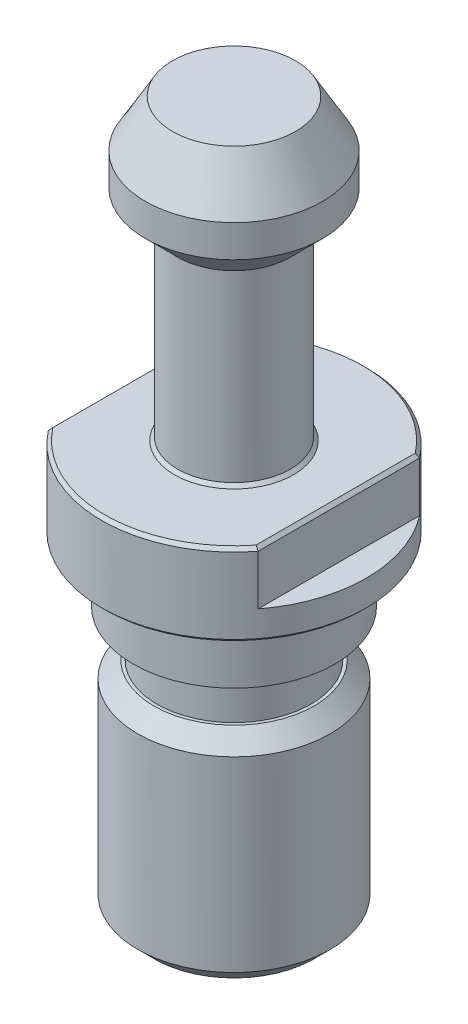
ISO-10303-21;
HEADER;
FILE_DESCRIPTION(('STEP AP214'),'2;1');
FILE_NAME('part.step','',(''),(''),'','','');
FILE_SCHEMA(('AUTOMOTIVE_DESIGN { 1 0 10303 214 1 1 1 1 }'));
ENDSEC;
DATA;
#1=APPLICATION_CONTEXT('core data for automotive mechanical design processes');
#2=APPLICATION_PROTOCOL_DEFINITION('international standard','automotive_design',2000,#1);
#3=PRODUCT_CONTEXT('',#1,'mechanical');
#4=PRODUCT('Part','Part','',(#3));
#5=PRODUCT_RELATED_PRODUCT_CATEGORY('part','',(#4));
#6=PRODUCT_DEFINITION_FORMATION('','',#4);
#7=PRODUCT_DEFINITION_CONTEXT('part definition',#1,'design');
#8=PRODUCT_DEFINITION('design','',#6,#7);
#9=PRODUCT_DEFINITION_SHAPE('','',#8);
#10=(LENGTH_UNIT() NAMED_UNIT(*) SI_UNIT(.MILLI.,.METRE.));
#11=(NAMED_UNIT(*) PLANE_ANGLE_UNIT() SI_UNIT($,.RADIAN.));
#12=(NAMED_UNIT(*) SI_UNIT($,.STERADIAN.) SOLID_ANGLE_UNIT());
#13=UNCERTAINTY_MEASURE_WITH_UNIT(LENGTH_MEASURE(1.E-05),#10,'distance_accuracy_value','');
#14=(GEOMETRIC_REPRESENTATION_CONTEXT(3) GLOBAL_UNCERTAINTY_ASSIGNED_CONTEXT((#13)) GLOBAL_UNIT_ASSIGNED_CONTEXT((#10,
#11,#12)) REPRESENTATION_CONTEXT('',''));
#15=CARTESIAN_POINT('',(0.,0.,0.));
#16=DIRECTION('',(0.,0.,1.));
#17=DIRECTION('',(1.,0.,0.));
#18=AXIS2_PLACEMENT_3D('',#15,#16,#17);
#19=CARTESIAN_POINT('',(0.,0.,0.));
#20=DIRECTION('',(0.,-1.,0.));
#21=DIRECTION('',(0.,0.,-1.));
#22=AXIS2_PLACEMENT_3D('',#19,#20,#21);
#23=CYLINDRICAL_SURFACE('',#22,8.22);
#24=CARTESIAN_POINT('',(0.,20.5,0.));
#25=DIRECTION('',(0.,-1.,0.));
#26=DIRECTION('',(0.,0.,-1.));
#27=AXIS2_PLACEMENT_3D('',#24,#25,#26);
#28=CIRCLE('',#27,8.22);
#29=CARTESIAN_POINT('',(0.,20.5,-8.22));
#30=VERTEX_POINT('',#29);
#31=EDGE_CURVE('E139',#30,#30,#28,.F.);
#32=ORIENTED_EDGE('',*,*,#31,.T.);
#33=EDGE_LOOP('',(#32));
#34=FACE_BOUND('',#33,.T.);
#35=DIRECTION('',(0.,1.,0.));
#36=VECTOR('',#35,1.);
#37=CARTESIAN_POINT('',(-6.515,22.1,-5.0123023651811));
#38=LINE('',#37,#36);
#39=CARTESIAN_POINT('',(-6.515,22.1,-5.0123023651811));
#40=VERTEX_POINT('',#39);
#41=CARTESIAN_POINT('',(-6.515,25.2,-5.0123023651811));
#42=VERTEX_POINT('',#41);
#43=EDGE_CURVE('E101',#40,#42,#38,.T.);
#44=ORIENTED_EDGE('',*,*,#43,.T.);
#45=CARTESIAN_POINT('',(0.,25.2,0.));
#46=DIRECTION('',(0.,1.,0.));
#47=DIRECTION('',(0.,0.,1.));
#48=AXIS2_PLACEMENT_3D('',#45,#46,#47);
#49=CIRCLE('',#48,8.22);
#50=CARTESIAN_POINT('',(6.515,25.2,-5.0123023651811));
#51=VERTEX_POINT('',#50);
#52=EDGE_CURVE('E137',#42,#51,#49,.F.);
#53=ORIENTED_EDGE('',*,*,#52,.T.);
#54=DIRECTION('',(0.,1.,0.));
#55=VECTOR('',#54,1.);
#56=CARTESIAN_POINT('',(6.515,22.1,-5.0123023651811));
#57=LINE('',#56,#55);
#58=CARTESIAN_POINT('',(6.515,22.1,-5.0123023651811));
#59=VERTEX_POINT('',#58);
#60=EDGE_CURVE('E199',#59,#51,#57,.T.);
#61=ORIENTED_EDGE('',*,*,#60,.F.);
#62=CARTESIAN_POINT('',(0.,22.1,0.));
#63=DIRECTION('',(0.,1.,0.));
#64=DIRECTION('',(0.,0.,1.));
#65=AXIS2_PLACEMENT_3D('',#62,#63,#64);
#66=CIRCLE('',#65,8.22);
#67=CARTESIAN_POINT('',(6.515,22.1,5.0123023651811));
#68=VERTEX_POINT('',#67);
#69=EDGE_CURVE('E118',#59,#68,#66,.F.);
#70=ORIENTED_EDGE('',*,*,#69,.T.);
#71=DIRECTION('',(0.,1.,0.));
#72=VECTOR('',#71,1.);
#73=CARTESIAN_POINT('',(6.515,22.1,5.0123023651811));
#74=LINE('',#73,#72);
#75=CARTESIAN_POINT('',(6.515,25.2,5.0123023651811));
#76=VERTEX_POINT('',#75);
#77=EDGE_CURVE('E208',#68,#76,#74,.T.);
#78=ORIENTED_EDGE('',*,*,#77,.T.);
#79=CARTESIAN_POINT('',(0.,25.2,0.));
#80=DIRECTION('',(0.,1.,0.));
#81=DIRECTION('',(0.,0.,1.));
#82=AXIS2_PLACEMENT_3D('',#79,#80,#81);
#83=CIRCLE('',#82,8.22);
#84=CARTESIAN_POINT('',(-6.515,25.2,5.0123023651811));
#85=VERTEX_POINT('',#84);
#86=EDGE_CURVE('E133',#76,#85,#83,.F.);
#87=ORIENTED_EDGE('',*,*,#86,.T.);
#88=DIRECTION('',(0.,1.,0.));
#89=VECTOR('',#88,1.);
#90=CARTESIAN_POINT('',(-6.515,22.1,5.0123023651811));
#91=LINE('',#90,#89);
#92=CARTESIAN_POINT('',(-6.515,22.1,5.0123023651811));
#93=VERTEX_POINT('',#92);
#94=EDGE_CURVE('E112',#93,#85,#91,.T.);
#95=ORIENTED_EDGE('',*,*,#94,.F.);
#96=EDGE_CURVE('E116',#93,#40,#66,.F.);
#97=ORIENTED_EDGE('',*,*,#96,.T.);
#98=EDGE_LOOP('',(#44,#53,#61,#70,#78,#87,#95,#97));
#99=FACE_BOUND('',#98,.T.);
#100=ADVANCED_FACE('F37',(#34,#99),#23,.T.);
#101=CARTESIAN_POINT('',(8.22,25.4,0.));
#102=DIRECTION('',(0.,1.,0.));
#103=DIRECTION('',(0.,0.,1.));
#104=AXIS2_PLACEMENT_3D('',#101,#102,#103);
#105=PLANE('',#104);
#106=CARTESIAN_POINT('',(0.,25.4,0.));
#107=DIRECTION('',(0.,1.,0.));
#108=DIRECTION('',(0.,0.,1.));
#109=AXIS2_PLACEMENT_3D('',#106,#107,#108);
#110=CIRCLE('',#109,8.02);
#111=CARTESIAN_POINT('',(6.315,25.4,-4.94380167482475));
#112=VERTEX_POINT('',#111);
#113=CARTESIAN_POINT('',(-6.315,25.4,-4.94380167482475));
#114=VERTEX_POINT('',#113);
#115=EDGE_CURVE('E65',#112,#114,#110,.T.);
#116=ORIENTED_EDGE('',*,*,#115,.T.);
#117=DIRECTION('',(0.,0.,1.));
#118=VECTOR('',#117,1.);
#119=CARTESIAN_POINT('',(-6.315,25.4,0.));
#120=LINE('',#119,#118);
#121=CARTESIAN_POINT('',(-6.315,25.4,4.94380167482475));
#122=VERTEX_POINT('',#121);
#123=EDGE_CURVE('E146',#114,#122,#120,.T.);
#124=ORIENTED_EDGE('',*,*,#123,.T.);
#125=CARTESIAN_POINT('',(0.,25.4,0.));
#126=DIRECTION('',(0.,1.,0.));
#127=DIRECTION('',(0.,0.,1.));
#128=AXIS2_PLACEMENT_3D('',#125,#126,#127);
#129=CIRCLE('',#128,8.02);
#130=CARTESIAN_POINT('',(6.315,25.4,4.94380167482475));
#131=VERTEX_POINT('',#130);
#132=EDGE_CURVE('E145',#122,#131,#129,.T.);
#133=ORIENTED_EDGE('',*,*,#132,.T.);
#134=DIRECTION('',(0.,0.,-1.));
#135=VECTOR('',#134,1.);
#136=CARTESIAN_POINT('',(6.315,25.4,0.));
#137=LINE('',#136,#135);
#138=EDGE_CURVE('E70',#131,#112,#137,.T.);
#139=ORIENTED_EDGE('',*,*,#138,.T.);
#140=EDGE_LOOP('',(#116,#124,#133,#139));
#141=FACE_BOUND('',#140,.T.);
#142=CARTESIAN_POINT('',(0.,25.4,0.));
#143=DIRECTION('',(0.,1.,0.));
#144=DIRECTION('',(0.,0.,1.));
#145=AXIS2_PLACEMENT_3D('',#142,#143,#144);
#146=CIRCLE('',#145,3.69999999999999);
#147=CARTESIAN_POINT('',(0.,25.4,3.69999999999999));
#148=VERTEX_POINT('',#147);
#149=EDGE_CURVE('E143',#148,#148,#146,.F.);
#150=ORIENTED_EDGE('',*,*,#149,.T.);
#151=EDGE_LOOP('',(#150));
#152=FACE_BOUND('',#151,.T.);
#153=ADVANCED_FACE('F262',(#141,#152),#105,.T.);
#154=CARTESIAN_POINT('',(0.,0.,0.));
#155=DIRECTION('',(0.,-1.,0.));
#156=DIRECTION('',(0.,0.,-1.));
#157=AXIS2_PLACEMENT_3D('',#154,#155,#156);
#158=PLANE('',#157);
#159=CARTESIAN_POINT('',(0.,0.,0.));
#160=DIRECTION('',(0.,-1.,0.));
#161=DIRECTION('',(0.,0.,-1.));
#162=AXIS2_PLACEMENT_3D('',#159,#160,#161);
#163=CIRCLE('',#162,4.97500000000001);
#164=CARTESIAN_POINT('',(0.,0.,-4.97500000000001));
#165=VERTEX_POINT('',#164);
#166=EDGE_CURVE('E124',#165,#165,#163,.T.);
#167=ORIENTED_EDGE('',*,*,#166,.T.);
#168=EDGE_LOOP('',(#167));
#169=FACE_BOUND('',#168,.T.);
#170=ADVANCED_FACE('F244',(#169),#158,.T.);
#171=CARTESIAN_POINT('',(0.,0.,0.));
#172=DIRECTION('',(0.,-1.,0.));
#173=DIRECTION('',(0.,0.,-1.));
#174=AXIS2_PLACEMENT_3D('',#171,#172,#173);
#175=CYLINDRICAL_SURFACE('',#174,5.975);
#176=CARTESIAN_POINT('',(0.,12.6,0.));
#177=DIRECTION('',(0.,1.,0.));
#178=DIRECTION('',(0.,0.,1.));
#179=AXIS2_PLACEMENT_3D('',#176,#177,#178);
#180=CIRCLE('',#179,5.975);
#181=CARTESIAN_POINT('',(0.,12.6,5.975));
#182=VERTEX_POINT('',#181);
#183=EDGE_CURVE('E237',#182,#182,#180,.F.);
#184=ORIENTED_EDGE('',*,*,#183,.T.);
#185=EDGE_LOOP('',(#184));
#186=FACE_BOUND('',#185,.T.);
#187=CARTESIAN_POINT('',(0.,1.,0.));
#188=DIRECTION('',(0.,-1.,0.));
#189=DIRECTION('',(0.,0.,-1.));
#190=AXIS2_PLACEMENT_3D('',#187,#188,#189);
#191=CIRCLE('',#190,5.975);
#192=CARTESIAN_POINT('',(0.,1.,-5.975));
#193=VERTEX_POINT('',#192);
#194=EDGE_CURVE('E232',#193,#193,#191,.F.);
#195=ORIENTED_EDGE('',*,*,#194,.T.);
#196=EDGE_LOOP('',(#195));
#197=FACE_BOUND('',#196,.T.);
#198=ADVANCED_FACE('F294',(#186,#197),#175,.T.);
#199=CARTESIAN_POINT('',(5.975,13.6,0.));
#200=DIRECTION('',(0.,1.,0.));
#201=DIRECTION('',(0.,0.,1.));
#202=AXIS2_PLACEMENT_3D('',#199,#200,#201);
#203=PLANE('',#202);
#204=CARTESIAN_POINT('',(0.,13.6,0.));
#205=DIRECTION('',(0.,1.,0.));
#206=DIRECTION('',(0.,0.,1.));
#207=AXIS2_PLACEMENT_3D('',#204,#205,#206);
#208=CIRCLE('',#207,4.975);
#209=CARTESIAN_POINT('',(0.,13.6,4.975));
#210=VERTEX_POINT('',#209);
#211=EDGE_CURVE('E236',#210,#210,#208,.T.);
#212=ORIENTED_EDGE('',*,*,#211,.T.);
#213=EDGE_LOOP('',(#212));
#214=FACE_BOUND('',#213,.T.);
#215=CARTESIAN_POINT('',(0.,13.6,0.));
#216=DIRECTION('',(0.,-1.,0.));
#217=DIRECTION('',(0.,0.,-1.));
#218=AXIS2_PLACEMENT_3D('',#215,#216,#217);
#219=CIRCLE('',#218,4.785);
#220=CARTESIAN_POINT('',(0.,13.6,-4.785));
#221=VERTEX_POINT('',#220);
#222=EDGE_CURVE('E229',#221,#221,#219,.T.);
#223=ORIENTED_EDGE('',*,*,#222,.T.);
#224=EDGE_LOOP('',(#223));
#225=FACE_BOUND('',#224,.T.);
#226=ADVANCED_FACE('F289',(#214,#225),#203,.T.);
#227=CARTESIAN_POINT('',(0.,0.,0.));
#228=DIRECTION('',(0.,-1.,0.));
#229=DIRECTION('',(0.,0.,-1.));
#230=AXIS2_PLACEMENT_3D('',#227,#228,#229);
#231=CYLINDRICAL_SURFACE('',#230,4.785);
#232=CARTESIAN_POINT('',(0.,16.5,0.));
#233=DIRECTION('',(0.,-1.,0.));
#234=DIRECTION('',(0.,0.,-1.));
#235=AXIS2_PLACEMENT_3D('',#232,#233,#234);
#236=CIRCLE('',#235,4.785);
#237=CARTESIAN_POINT('',(0.,16.5,-4.785));
#238=VERTEX_POINT('',#237);
#239=EDGE_CURVE('E230',#238,#238,#236,.T.);
#240=ORIENTED_EDGE('',*,*,#239,.T.);
#241=EDGE_LOOP('',(#240));
#242=FACE_BOUND('',#241,.T.);
#243=ORIENTED_EDGE('',*,*,#222,.F.);
#244=EDGE_LOOP('',(#243));
#245=FACE_BOUND('',#244,.T.);
#246=ADVANCED_FACE('F286',(#242,#245),#231,.T.);
#247=CARTESIAN_POINT('',(4.785,16.5,0.));
#248=DIRECTION('',(0.,-1.,0.));
#249=DIRECTION('',(0.,0.,-1.));
#250=AXIS2_PLACEMENT_3D('',#247,#248,#249);
#251=PLANE('',#250);
#252=CARTESIAN_POINT('',(0.,16.5,0.));
#253=DIRECTION('',(0.,-1.,0.));
#254=DIRECTION('',(0.,0.,-1.));
#255=AXIS2_PLACEMENT_3D('',#252,#253,#254);
#256=CIRCLE('',#255,6.265);
#257=CARTESIAN_POINT('',(0.,16.5,-6.265));
#258=VERTEX_POINT('',#257);
#259=EDGE_CURVE('E221',#258,#258,#256,.T.);
#260=ORIENTED_EDGE('',*,*,#259,.T.);
#261=EDGE_LOOP('',(#260));
#262=FACE_BOUND('',#261,.T.);
#263=ORIENTED_EDGE('',*,*,#239,.F.);
#264=EDGE_LOOP('',(#263));
#265=FACE_BOUND('',#264,.T.);
#266=ADVANCED_FACE('F285',(#262,#265),#251,.T.);
#267=CARTESIAN_POINT('',(0.,0.,0.));
#268=DIRECTION('',(0.,-1.,0.));
#269=DIRECTION('',(0.,0.,-1.));
#270=AXIS2_PLACEMENT_3D('',#267,#268,#269);
#271=CYLINDRICAL_SURFACE('',#270,6.265);
#272=CARTESIAN_POINT('',(0.,20.1,0.));
#273=DIRECTION('',(0.,-1.,0.));
#274=DIRECTION('',(0.,0.,-1.));
#275=AXIS2_PLACEMENT_3D('',#272,#273,#274);
#276=CIRCLE('',#275,6.265);
#277=CARTESIAN_POINT('',(0.,20.1,-6.265));
#278=VERTEX_POINT('',#277);
#279=EDGE_CURVE('E117',#278,#278,#276,.T.);
#280=ORIENTED_EDGE('',*,*,#279,.T.);
#281=EDGE_LOOP('',(#280));
#282=FACE_BOUND('',#281,.T.);
#283=ORIENTED_EDGE('',*,*,#259,.F.);
#284=EDGE_LOOP('',(#283));
#285=FACE_BOUND('',#284,.T.);
#286=ADVANCED_FACE('F279',(#282,#285),#271,.T.);
#287=CARTESIAN_POINT('',(6.265,20.3,0.));
#288=DIRECTION('',(0.,-1.,0.));
#289=DIRECTION('',(0.,0.,-1.));
#290=AXIS2_PLACEMENT_3D('',#287,#288,#289);
#291=PLANE('',#290);
#292=CARTESIAN_POINT('',(0.,20.3,0.));
#293=DIRECTION('',(0.,-1.,0.));
#294=DIRECTION('',(0.,0.,-1.));
#295=AXIS2_PLACEMENT_3D('',#292,#293,#294);
#296=CIRCLE('',#295,6.46499999999999);
#297=CARTESIAN_POINT('',(0.,20.3,-6.46499999999999));
#298=VERTEX_POINT('',#297);
#299=EDGE_CURVE('E131',#298,#298,#296,.F.);
#300=ORIENTED_EDGE('',*,*,#299,.T.);
#301=EDGE_LOOP('',(#300));
#302=FACE_BOUND('',#301,.T.);
#303=CARTESIAN_POINT('',(0.,20.3,0.));
#304=DIRECTION('',(0.,-1.,0.));
#305=DIRECTION('',(0.,0.,-1.));
#306=AXIS2_PLACEMENT_3D('',#303,#304,#305);
#307=CIRCLE('',#306,8.01999999999999);
#308=CARTESIAN_POINT('',(0.,20.3,-8.01999999999999));
#309=VERTEX_POINT('',#308);
#310=EDGE_CURVE('E125',#309,#309,#307,.T.);
#311=ORIENTED_EDGE('',*,*,#310,.T.);
#312=EDGE_LOOP('',(#311));
#313=FACE_BOUND('',#312,.T.);
#314=ADVANCED_FACE('F273',(#302,#313),#291,.T.);
#315=CARTESIAN_POINT('',(0.,0.,0.));
#316=DIRECTION('',(0.,-1.,0.));
#317=DIRECTION('',(0.,0.,-1.));
#318=AXIS2_PLACEMENT_3D('',#315,#316,#317);
#319=CYLINDRICAL_SURFACE('',#318,3.5);
#320=CARTESIAN_POINT('',(0.,25.6,0.));
#321=DIRECTION('',(0.,1.,0.));
#322=DIRECTION('',(0.,0.,1.));
#323=AXIS2_PLACEMENT_3D('',#320,#321,#322);
#324=CIRCLE('',#323,3.5);
#325=CARTESIAN_POINT('',(0.,25.6,3.5));
#326=VERTEX_POINT('',#325);
#327=EDGE_CURVE('E12',#326,#326,#324,.T.);
#328=ORIENTED_EDGE('',*,*,#327,.T.);
#329=EDGE_LOOP('',(#328));
#330=FACE_BOUND('',#329,.T.);
#331=CARTESIAN_POINT('',(0.,37.,0.));
#332=DIRECTION('',(0.,-1.,0.));
#333=DIRECTION('',(0.,0.,-1.));
#334=AXIS2_PLACEMENT_3D('',#331,#332,#333);
#335=CIRCLE('',#334,3.5);
#336=CARTESIAN_POINT('',(0.,37.,-3.5));
#337=VERTEX_POINT('',#336);
#338=EDGE_CURVE('E222',#337,#337,#335,.T.);
#339=ORIENTED_EDGE('',*,*,#338,.T.);
#340=EDGE_LOOP('',(#339));
#341=FACE_BOUND('',#340,.T.);
#342=ADVANCED_FACE('F280',(#330,#341),#319,.T.);
#343=CARTESIAN_POINT('',(0.,37.,0.));
#344=DIRECTION('',(0.,1.,0.));
#345=DIRECTION('',(0.,0.,1.));
#346=AXIS2_PLACEMENT_3D('',#343,#344,#345);
#347=CONICAL_SURFACE('',#346,3.5,0.78539816339745);
#348=CARTESIAN_POINT('',(0.,39.,0.));
#349=DIRECTION('',(0.,-1.,0.));
#350=DIRECTION('',(0.,0.,-1.));
#351=AXIS2_PLACEMENT_3D('',#348,#349,#350);
#352=CIRCLE('',#351,5.5);
#353=CARTESIAN_POINT('',(0.,39.,-5.5));
#354=VERTEX_POINT('',#353);
#355=EDGE_CURVE('E217',#354,#354,#352,.T.);
#356=ORIENTED_EDGE('',*,*,#355,.T.);
#357=EDGE_LOOP('',(#356));
#358=FACE_BOUND('',#357,.T.);
#359=ORIENTED_EDGE('',*,*,#338,.F.);
#360=EDGE_LOOP('',(#359));
#361=FACE_BOUND('',#360,.T.);
#362=ADVANCED_FACE('F394',(#358,#361),#347,.T.);
#363=CARTESIAN_POINT('',(0.,0.,0.));
#364=DIRECTION('',(0.,-1.,0.));
#365=DIRECTION('',(0.,0.,-1.));
#366=AXIS2_PLACEMENT_3D('',#363,#364,#365);
#367=CYLINDRICAL_SURFACE('',#366,5.5);
#368=CARTESIAN_POINT('',(0.,41.,0.));
#369=DIRECTION('',(0.,-1.,0.));
#370=DIRECTION('',(0.,0.,-1.));
#371=AXIS2_PLACEMENT_3D('',#368,#369,#370);
#372=CIRCLE('',#371,5.5);
#373=CARTESIAN_POINT('',(0.,41.,-5.5));
#374=VERTEX_POINT('',#373);
#375=EDGE_CURVE('E214',#374,#374,#372,.T.);
#376=ORIENTED_EDGE('',*,*,#375,.T.);
#377=EDGE_LOOP('',(#376));
#378=FACE_BOUND('',#377,.T.);
#379=ORIENTED_EDGE('',*,*,#355,.F.);
#380=EDGE_LOOP('',(#379));
#381=FACE_BOUND('',#380,.T.);
#382=ADVANCED_FACE('F398',(#378,#381),#367,.T.);
#383=CARTESIAN_POINT('',(0.,41.,0.));
#384=DIRECTION('',(0.,-1.,0.));
#385=DIRECTION('',(0.,0.,-1.));
#386=AXIS2_PLACEMENT_3D('',#383,#384,#385);
#387=CONICAL_SURFACE('',#386,5.5,0.5235987755983);
#388=CARTESIAN_POINT('',(0.,43.92,0.));
#389=DIRECTION('',(0.,-1.,0.));
#390=DIRECTION('',(0.,0.,-1.));
#391=AXIS2_PLACEMENT_3D('',#388,#389,#390);
#392=CIRCLE('',#391,3.81413721396628);
#393=CARTESIAN_POINT('',(0.,43.92,-3.81413721396628));
#394=VERTEX_POINT('',#393);
#395=EDGE_CURVE('E210',#394,#394,#392,.T.);
#396=ORIENTED_EDGE('',*,*,#395,.T.);
#397=EDGE_LOOP('',(#396));
#398=FACE_BOUND('',#397,.T.);
#399=ORIENTED_EDGE('',*,*,#375,.F.);
#400=EDGE_LOOP('',(#399));
#401=FACE_BOUND('',#400,.T.);
#402=ADVANCED_FACE('F403',(#398,#401),#387,.T.);
#403=CARTESIAN_POINT('',(3.81413721396628,43.92,0.));
#404=DIRECTION('',(0.,1.,0.));
#405=DIRECTION('',(0.,0.,1.));
#406=AXIS2_PLACEMENT_3D('',#403,#404,#405);
#407=PLANE('',#406);
#408=ORIENTED_EDGE('',*,*,#395,.F.);
#409=EDGE_LOOP('',(#408));
#410=FACE_BOUND('',#409,.T.);
#411=ADVANCED_FACE('F256',(#410),#407,.T.);
#412=CARTESIAN_POINT('',(0.,12.6,0.));
#413=DIRECTION('',(0.,-1.,0.));
#414=DIRECTION('',(0.,0.,-1.));
#415=AXIS2_PLACEMENT_3D('',#412,#413,#414);
#416=CONICAL_SURFACE('',#415,5.975,0.785398163397452);
#417=ORIENTED_EDGE('',*,*,#211,.F.);
#418=EDGE_LOOP('',(#417));
#419=FACE_BOUND('',#418,.T.);
#420=ORIENTED_EDGE('',*,*,#183,.F.);
#421=EDGE_LOOP('',(#420));
#422=FACE_BOUND('',#421,.T.);
#423=ADVANCED_FACE('F246',(#419,#422),#416,.T.);
#424=CARTESIAN_POINT('',(0.,0.,0.));
#425=DIRECTION('',(0.,1.,0.));
#426=DIRECTION('',(0.,0.,1.));
#427=AXIS2_PLACEMENT_3D('',#424,#425,#426);
#428=CONICAL_SURFACE('',#427,4.97500000000001,0.785398163397444);
#429=ORIENTED_EDGE('',*,*,#194,.F.);
#430=EDGE_LOOP('',(#429));
#431=FACE_BOUND('',#430,.T.);
#432=ORIENTED_EDGE('',*,*,#166,.F.);
#433=EDGE_LOOP('',(#432));
#434=FACE_BOUND('',#433,.T.);
#435=ADVANCED_FACE('F250',(#431,#434),#428,.T.);
#436=CARTESIAN_POINT('',(-6.515,22.1,5.0123023651811));
#437=DIRECTION('',(-1.,0.,0.));
#438=DIRECTION('',(0.,0.,1.));
#439=AXIS2_PLACEMENT_3D('',#436,#437,#438);
#440=PLANE('',#439);
#441=ORIENTED_EDGE('',*,*,#94,.T.);
#442=DIRECTION('',(0.,0.,-1.));
#443=VECTOR('',#442,1.);
#444=CARTESIAN_POINT('',(-6.515,25.2,5.0123023651811));
#445=LINE('',#444,#443);
#446=EDGE_CURVE('E107',#85,#42,#445,.T.);
#447=ORIENTED_EDGE('',*,*,#446,.T.);
#448=ORIENTED_EDGE('',*,*,#43,.F.);
#449=DIRECTION('',(0.,0.,1.));
#450=VECTOR('',#449,1.);
#451=CARTESIAN_POINT('',(-6.515,22.1,5.0123023651811));
#452=LINE('',#451,#450);
#453=EDGE_CURVE('E104',#40,#93,#452,.T.);
#454=ORIENTED_EDGE('',*,*,#453,.T.);
#455=EDGE_LOOP('',(#441,#447,#448,#454));
#456=FACE_BOUND('',#455,.T.);
#457=ADVANCED_FACE('F102',(#456),#440,.T.);
#458=CARTESIAN_POINT('',(0.,22.1,0.));
#459=DIRECTION('',(0.,1.,0.));
#460=DIRECTION('',(0.,0.,1.));
#461=AXIS2_PLACEMENT_3D('',#458,#459,#460);
#462=PLANE('',#461);
#463=ORIENTED_EDGE('',*,*,#453,.F.);
#464=ORIENTED_EDGE('',*,*,#96,.F.);
#465=EDGE_LOOP('',(#463,#464));
#466=FACE_BOUND('',#465,.T.);
#467=ADVANCED_FACE('F113',(#466),#462,.T.);
#468=DIRECTION('',(0.,0.,-1.));
#469=VECTOR('',#468,1.);
#470=CARTESIAN_POINT('',(6.515,22.1,5.0123023651811));
#471=LINE('',#470,#469);
#472=EDGE_CURVE('E115',#68,#59,#471,.T.);
#473=ORIENTED_EDGE('',*,*,#472,.F.);
#474=ORIENTED_EDGE('',*,*,#69,.F.);
#475=EDGE_LOOP('',(#473,#474));
#476=FACE_BOUND('',#475,.T.);
#477=ADVANCED_FACE('F341',(#476),#462,.T.);
#478=CARTESIAN_POINT('',(6.515,22.1,5.0123023651811));
#479=DIRECTION('',(1.,0.,0.));
#480=DIRECTION('',(0.,0.,-1.));
#481=AXIS2_PLACEMENT_3D('',#478,#479,#480);
#482=PLANE('',#481);
#483=ORIENTED_EDGE('',*,*,#60,.T.);
#484=DIRECTION('',(0.,0.,1.));
#485=VECTOR('',#484,1.);
#486=CARTESIAN_POINT('',(6.515,25.2,5.0123023651811));
#487=LINE('',#486,#485);
#488=EDGE_CURVE('E53',#51,#76,#487,.T.);
#489=ORIENTED_EDGE('',*,*,#488,.T.);
#490=ORIENTED_EDGE('',*,*,#77,.F.);
#491=ORIENTED_EDGE('',*,*,#472,.T.);
#492=EDGE_LOOP('',(#483,#489,#490,#491));
#493=FACE_BOUND('',#492,.T.);
#494=ADVANCED_FACE('F204',(#493),#482,.T.);
#495=CARTESIAN_POINT('',(0.,20.1,0.));
#496=DIRECTION('',(0.,1.,0.));
#497=DIRECTION('',(0.,0.,1.));
#498=AXIS2_PLACEMENT_3D('',#495,#496,#497);
#499=CONICAL_SURFACE('',#498,6.265,0.785398163397448);
#500=ORIENTED_EDGE('',*,*,#299,.F.);
#501=EDGE_LOOP('',(#500));
#502=FACE_BOUND('',#501,.T.);
#503=ORIENTED_EDGE('',*,*,#279,.F.);
#504=EDGE_LOOP('',(#503));
#505=FACE_BOUND('',#504,.T.);
#506=ADVANCED_FACE('F355',(#502,#505),#499,.T.);
#507=CARTESIAN_POINT('',(0.,20.3,0.));
#508=DIRECTION('',(0.,1.,0.));
#509=DIRECTION('',(0.,0.,1.));
#510=AXIS2_PLACEMENT_3D('',#507,#508,#509);
#511=CONICAL_SURFACE('',#510,8.01999999999999,0.78539816339747);
#512=ORIENTED_EDGE('',*,*,#31,.F.);
#513=EDGE_LOOP('',(#512));
#514=FACE_BOUND('',#513,.T.);
#515=ORIENTED_EDGE('',*,*,#310,.F.);
#516=EDGE_LOOP('',(#515));
#517=FACE_BOUND('',#516,.T.);
#518=ADVANCED_FACE('F182',(#514,#517),#511,.T.);
#519=CARTESIAN_POINT('',(6.315,25.4,0.));
#520=DIRECTION('',(-0.707106781186538,-0.707106781186557,0.));
#521=DIRECTION('',(0.707106781186557,-0.707106781186538,0.));
#522=AXIS2_PLACEMENT_3D('',#519,#520,#521);
#523=PLANE('',#522);
#524=CARTESIAN_POINT('',(6.515,25.2,5.0123023651811));
#525=CARTESIAN_POINT('',(6.4816539603287,25.2333460396713,5.00095978187297));
#526=CARTESIAN_POINT('',(6.44831427395347,25.2666857260465,4.9895800993997));
#527=CARTESIAN_POINT('',(6.38164760728661,25.3333523927134,4.96674653594872));
#528=CARTESIAN_POINT('',(6.34832062699518,25.3666793730048,4.95529265496987));
#529=CARTESIAN_POINT('',(6.315,25.4,4.94380167482475));
#530=B_SPLINE_CURVE_WITH_KNOTS('',3,(#524,#525,#526,#527,#528,#529),.UNSPECIFIED.,.F.,.F.,(4,2,
4),(0.,0.145509789827056,0.291019581873897),.UNSPECIFIED.);
#531=EDGE_CURVE('E184',#76,#131,#530,.T.);
#532=ORIENTED_EDGE('',*,*,#531,.F.);
#533=ORIENTED_EDGE('',*,*,#488,.F.);
#534=CARTESIAN_POINT('',(6.515,25.2,-5.0123023651811));
#535=CARTESIAN_POINT('',(6.48165396032871,25.2333460396713,-5.00095978187297));
#536=CARTESIAN_POINT('',(6.44831427395347,25.2666857260465,-4.9895800993997));
#537=CARTESIAN_POINT('',(6.38164760728661,25.3333523927134,-4.96674653594872));
#538=CARTESIAN_POINT('',(6.34832062699518,25.3666793730048,-4.95529265496987));
#539=CARTESIAN_POINT('',(6.315,25.4,-4.94380167482475));
#540=B_SPLINE_CURVE_WITH_KNOTS('',3,(#534,#535,#536,#537,#538,#539),.UNSPECIFIED.,.F.,.F.,(4,2,
4),(0.,0.145509789827057,0.291019581873898),.UNSPECIFIED.);
#541=EDGE_CURVE('E42',#112,#51,#540,.F.);
#542=ORIENTED_EDGE('',*,*,#541,.F.);
#543=ORIENTED_EDGE('',*,*,#138,.F.);
#544=EDGE_LOOP('',(#532,#533,#542,#543));
#545=FACE_BOUND('',#544,.T.);
#546=ADVANCED_FACE('F176',(#545),#523,.F.);
#547=CARTESIAN_POINT('',(0.,25.2,0.));
#548=DIRECTION('',(0.,-1.,0.));
#549=DIRECTION('',(0.,0.,-1.));
#550=AXIS2_PLACEMENT_3D('',#547,#548,#549);
#551=CONICAL_SURFACE('',#550,8.22,0.785398163397461);
#552=ORIENTED_EDGE('',*,*,#541,.T.);
#553=ORIENTED_EDGE('',*,*,#52,.F.);
#554=CARTESIAN_POINT('',(-6.515,25.2,-5.0123023651811));
#555=CARTESIAN_POINT('',(-6.48165396032871,25.2333460396713,-5.00095978187297));
#556=CARTESIAN_POINT('',(-6.44831427395347,25.2666857260465,-4.9895800993997));
#557=CARTESIAN_POINT('',(-6.38164760728661,25.3333523927134,-4.96674653594872));
#558=CARTESIAN_POINT('',(-6.34832062699518,25.3666793730048,-4.95529265496987));
#559=CARTESIAN_POINT('',(-6.315,25.4,-4.94380167482475));
#560=B_SPLINE_CURVE_WITH_KNOTS('',3,(#554,#555,#556,#557,#558,#559),.UNSPECIFIED.,.F.,.F.,(4,2,
4),(0.,0.145509789827057,0.291019581873898),.UNSPECIFIED.);
#561=EDGE_CURVE('E159',#114,#42,#560,.F.);
#562=ORIENTED_EDGE('',*,*,#561,.F.);
#563=ORIENTED_EDGE('',*,*,#115,.F.);
#564=EDGE_LOOP('',(#552,#553,#562,#563));
#565=FACE_BOUND('',#564,.T.);
#566=ADVANCED_FACE('F175',(#565),#551,.T.);
#567=CARTESIAN_POINT('',(0.,25.2,0.));
#568=DIRECTION('',(0.,-1.,0.));
#569=DIRECTION('',(0.,0.,-1.));
#570=AXIS2_PLACEMENT_3D('',#567,#568,#569);
#571=CONICAL_SURFACE('',#570,8.22,0.785398163397461);
#572=ORIENTED_EDGE('',*,*,#531,.T.);
#573=ORIENTED_EDGE('',*,*,#132,.F.);
#574=CARTESIAN_POINT('',(-6.315,25.4,4.94380167482475));
#575=CARTESIAN_POINT('',(-6.34832062699518,25.3666793730048,4.95529265496987));
#576=CARTESIAN_POINT('',(-6.38164760728661,25.3333523927134,4.96674653594872));
#577=CARTESIAN_POINT('',(-6.44831427395347,25.2666857260465,4.9895800993997));
#578=CARTESIAN_POINT('',(-6.48165396032871,25.2333460396713,5.00095978187297));
#579=CARTESIAN_POINT('',(-6.515,25.2,5.0123023651811));
#580=B_SPLINE_CURVE_WITH_KNOTS('',3,(#574,#575,#576,#577,#578,#579),.UNSPECIFIED.,.F.,.F.,(4,2,
4),(0.,0.14550979204684,0.291019581873897),.UNSPECIFIED.);
#581=EDGE_CURVE('E155',#85,#122,#580,.F.);
#582=ORIENTED_EDGE('',*,*,#581,.F.);
#583=ORIENTED_EDGE('',*,*,#86,.F.);
#584=EDGE_LOOP('',(#572,#573,#582,#583));
#585=FACE_BOUND('',#584,.T.);
#586=ADVANCED_FACE('F164',(#585),#571,.T.);
#587=CARTESIAN_POINT('',(-6.315,25.4,0.));
#588=DIRECTION('',(0.707106781186538,-0.707106781186557,0.));
#589=DIRECTION('',(0.707106781186557,0.707106781186538,0.));
#590=AXIS2_PLACEMENT_3D('',#587,#588,#589);
#591=PLANE('',#590);
#592=ORIENTED_EDGE('',*,*,#561,.T.);
#593=ORIENTED_EDGE('',*,*,#446,.F.);
#594=ORIENTED_EDGE('',*,*,#581,.T.);
#595=ORIENTED_EDGE('',*,*,#123,.F.);
#596=EDGE_LOOP('',(#592,#593,#594,#595));
#597=FACE_BOUND('',#596,.T.);
#598=ADVANCED_FACE('F169',(#597),#591,.F.);
#599=CARTESIAN_POINT('',(0.,25.4,0.));
#600=DIRECTION('',(0.,-1.,0.));
#601=DIRECTION('',(0.,0.,-1.));
#602=AXIS2_PLACEMENT_3D('',#599,#600,#601);
#603=CONICAL_SURFACE('',#602,3.69999999999999,0.785398163397466);
#604=ORIENTED_EDGE('',*,*,#327,.F.);
#605=EDGE_LOOP('',(#604));
#606=FACE_BOUND('',#605,.T.);
#607=ORIENTED_EDGE('',*,*,#149,.F.);
#608=EDGE_LOOP('',(#607));
#609=FACE_BOUND('',#608,.T.);
#610=ADVANCED_FACE('F45',(#606,#609),#603,.T.);
#611=CLOSED_SHELL('',(#100,#153,#170,#198,#226,#246,#266,#286,#314,#342,#362,#382,#402,#411,
#423,#435,#457,#467,#477,#494,#506,#518,#546,#566,#586,#598,#610));
#612=MANIFOLD_SOLID_BREP('B2',#611);
#613=ADVANCED_BREP_SHAPE_REPRESENTATION('',(#18,#612),#14);
#614=SHAPE_DEFINITION_REPRESENTATION(#9,#613);
ENDSEC;
END-ISO-10303-21;
